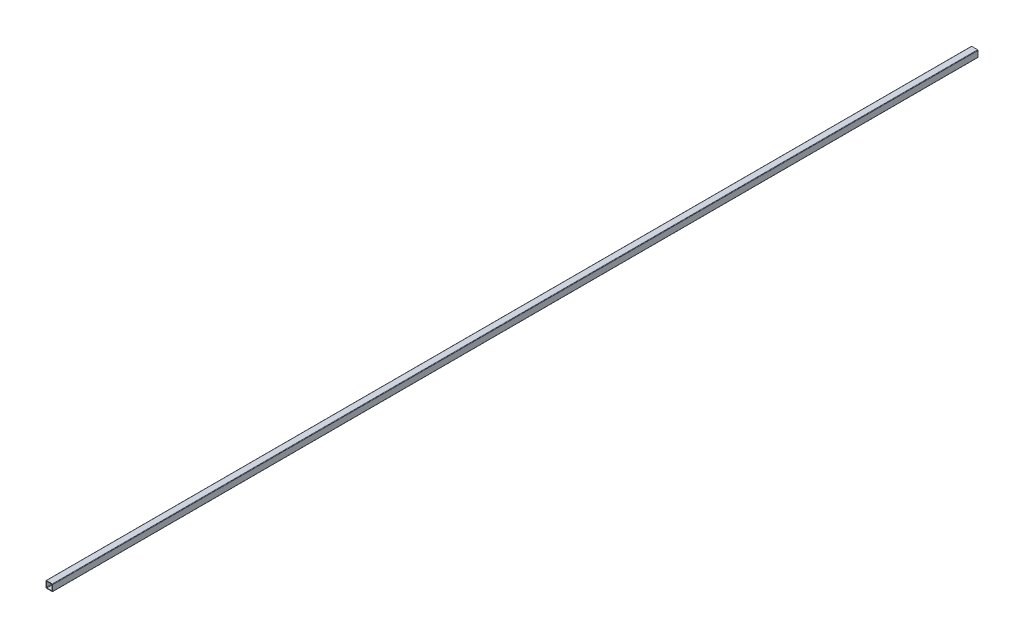
ISO-10303-21;
HEADER;
FILE_DESCRIPTION(('STEP AP214'),'2;1');
FILE_NAME('part.step','',(''),(''),'','','');
FILE_SCHEMA(('AUTOMOTIVE_DESIGN { 1 0 10303 214 1 1 1 1 }'));
ENDSEC;
DATA;
#1=APPLICATION_CONTEXT('core data for automotive mechanical design processes');
#2=APPLICATION_PROTOCOL_DEFINITION('international standard','automotive_design',2000,#1);
#3=PRODUCT_CONTEXT('',#1,'mechanical');
#4=PRODUCT('Part','Part','',(#3));
#5=PRODUCT_RELATED_PRODUCT_CATEGORY('part','',(#4));
#6=PRODUCT_DEFINITION_FORMATION('','',#4);
#7=PRODUCT_DEFINITION_CONTEXT('part definition',#1,'design');
#8=PRODUCT_DEFINITION('design','',#6,#7);
#9=PRODUCT_DEFINITION_SHAPE('','',#8);
#10=(LENGTH_UNIT() NAMED_UNIT(*) SI_UNIT(.MILLI.,.METRE.));
#11=(NAMED_UNIT(*) PLANE_ANGLE_UNIT() SI_UNIT($,.RADIAN.));
#12=(NAMED_UNIT(*) SI_UNIT($,.STERADIAN.) SOLID_ANGLE_UNIT());
#13=UNCERTAINTY_MEASURE_WITH_UNIT(LENGTH_MEASURE(1.E-05),#10,'distance_accuracy_value','');
#14=(GEOMETRIC_REPRESENTATION_CONTEXT(3) GLOBAL_UNCERTAINTY_ASSIGNED_CONTEXT((#13)) GLOBAL_UNIT_ASSIGNED_CONTEXT((#10,
#11,#12)) REPRESENTATION_CONTEXT('',''));
#15=CARTESIAN_POINT('',(0.,0.,0.));
#16=DIRECTION('',(0.,0.,1.));
#17=DIRECTION('',(1.,0.,0.));
#18=AXIS2_PLACEMENT_3D('',#15,#16,#17);
#19=CARTESIAN_POINT('',(2.54,-35.56,5243.80000006));
#20=DIRECTION('',(0.,0.,1.));
#21=DIRECTION('',(1.,0.,0.));
#22=AXIS2_PLACEMENT_3D('',#19,#20,#21);
#23=PLANE('',#22);
#24=CARTESIAN_POINT('',(2.54,-35.56,5243.80000006));
#25=DIRECTION('',(0.,0.,1.));
#26=DIRECTION('',(1.,0.,0.));
#27=AXIS2_PLACEMENT_3D('',#24,#25,#26);
#28=CIRCLE('',#27,2.54);
#29=CARTESIAN_POINT('',(0.,-35.56,5243.80000006));
#30=VERTEX_POINT('',#29);
#31=CARTESIAN_POINT('',(2.54000000000002,-38.1,5243.80000006));
#32=VERTEX_POINT('',#31);
#33=EDGE_CURVE('E210',#30,#32,#28,.T.);
#34=ORIENTED_EDGE('',*,*,#33,.T.);
#35=DIRECTION('',(1.,0.,0.));
#36=VECTOR('',#35,1.);
#37=CARTESIAN_POINT('',(2.54000000000002,-38.1,5243.80000006));
#38=LINE('',#37,#36);
#39=CARTESIAN_POINT('',(35.56,-38.1,5243.80000006));
#40=VERTEX_POINT('',#39);
#41=EDGE_CURVE('E213',#32,#40,#38,.T.);
#42=ORIENTED_EDGE('',*,*,#41,.T.);
#43=CARTESIAN_POINT('',(35.56,-35.56,5243.80000006));
#44=DIRECTION('',(0.,0.,1.));
#45=DIRECTION('',(-1.,0.,0.));
#46=AXIS2_PLACEMENT_3D('',#43,#44,#45);
#47=CIRCLE('',#46,2.54);
#48=CARTESIAN_POINT('',(38.1,-35.56,5243.80000006));
#49=VERTEX_POINT('',#48);
#50=EDGE_CURVE('E216',#40,#49,#47,.T.);
#51=ORIENTED_EDGE('',*,*,#50,.T.);
#52=DIRECTION('',(0.,1.,0.));
#53=VECTOR('',#52,1.);
#54=CARTESIAN_POINT('',(38.1,-2.54000000000002,5243.80000006));
#55=LINE('',#54,#53);
#56=CARTESIAN_POINT('',(38.1,-2.54000000000002,5243.80000006));
#57=VERTEX_POINT('',#56);
#58=EDGE_CURVE('E218',#49,#57,#55,.T.);
#59=ORIENTED_EDGE('',*,*,#58,.T.);
#60=CARTESIAN_POINT('',(35.56,-2.54,5243.80000006));
#61=DIRECTION('',(0.,0.,1.));
#62=DIRECTION('',(1.,0.,0.));
#63=AXIS2_PLACEMENT_3D('',#60,#61,#62);
#64=CIRCLE('',#63,2.54);
#65=CARTESIAN_POINT('',(35.56,0.,5243.80000006));
#66=VERTEX_POINT('',#65);
#67=EDGE_CURVE('E220',#57,#66,#64,.T.);
#68=ORIENTED_EDGE('',*,*,#67,.T.);
#69=DIRECTION('',(-1.,0.,0.));
#70=VECTOR('',#69,1.);
#71=CARTESIAN_POINT('',(2.54000000000002,0.,5243.80000006));
#72=LINE('',#71,#70);
#73=CARTESIAN_POINT('',(2.54000000000002,0.,5243.80000006));
#74=VERTEX_POINT('',#73);
#75=EDGE_CURVE('E222',#66,#74,#72,.T.);
#76=ORIENTED_EDGE('',*,*,#75,.T.);
#77=CARTESIAN_POINT('',(2.54,-2.54,5243.80000006));
#78=DIRECTION('',(0.,0.,1.));
#79=DIRECTION('',(-1.,0.,0.));
#80=AXIS2_PLACEMENT_3D('',#77,#78,#79);
#81=CIRCLE('',#80,2.54);
#82=CARTESIAN_POINT('',(0.,-2.54000000000002,5243.80000006));
#83=VERTEX_POINT('',#82);
#84=EDGE_CURVE('E224',#74,#83,#81,.T.);
#85=ORIENTED_EDGE('',*,*,#84,.T.);
#86=DIRECTION('',(0.,-1.,0.));
#87=VECTOR('',#86,1.);
#88=CARTESIAN_POINT('',(0.,-2.54000000000002,5243.80000006));
#89=LINE('',#88,#87);
#90=EDGE_CURVE('E226',#83,#30,#89,.T.);
#91=ORIENTED_EDGE('',*,*,#90,.T.);
#92=EDGE_LOOP('',(#34,#42,#51,#59,#68,#76,#85,#91));
#93=FACE_BOUND('',#92,.T.);
#94=DIRECTION('',(1.,0.,0.));
#95=VECTOR('',#94,1.);
#96=CARTESIAN_POINT('',(5.30860000000002,-35.3314,5243.80000006));
#97=LINE('',#96,#95);
#98=CARTESIAN_POINT('',(5.30860000000002,-35.3314,5243.80000006));
#99=VERTEX_POINT('',#98);
#100=CARTESIAN_POINT('',(32.7914,-35.3314,5243.80000006));
#101=VERTEX_POINT('',#100);
#102=EDGE_CURVE('E153',#99,#101,#97,.T.);
#103=ORIENTED_EDGE('',*,*,#102,.F.);
#104=CARTESIAN_POINT('',(5.3086,-32.7914,5243.80000006));
#105=DIRECTION('',(0.,0.,1.));
#106=DIRECTION('',(1.,0.,0.));
#107=AXIS2_PLACEMENT_3D('',#104,#105,#106);
#108=CIRCLE('',#107,2.54);
#109=CARTESIAN_POINT('',(2.7686,-32.7914,5243.80000006));
#110=VERTEX_POINT('',#109);
#111=EDGE_CURVE('E145',#110,#99,#108,.T.);
#112=ORIENTED_EDGE('',*,*,#111,.F.);
#113=DIRECTION('',(0.,-1.,0.));
#114=VECTOR('',#113,1.);
#115=CARTESIAN_POINT('',(2.7686,-5.30860000000002,5243.80000006));
#116=LINE('',#115,#114);
#117=CARTESIAN_POINT('',(2.7686,-5.30860000000002,5243.80000006));
#118=VERTEX_POINT('',#117);
#119=EDGE_CURVE('E178',#118,#110,#116,.T.);
#120=ORIENTED_EDGE('',*,*,#119,.F.);
#121=CARTESIAN_POINT('',(5.3086,-5.3086,5243.80000006));
#122=DIRECTION('',(0.,0.,1.));
#123=DIRECTION('',(1.,0.,0.));
#124=AXIS2_PLACEMENT_3D('',#121,#122,#123);
#125=CIRCLE('',#124,2.54);
#126=CARTESIAN_POINT('',(5.30860000000002,-2.7686,5243.80000006));
#127=VERTEX_POINT('',#126);
#128=EDGE_CURVE('E176',#127,#118,#125,.T.);
#129=ORIENTED_EDGE('',*,*,#128,.F.);
#130=DIRECTION('',(-1.,0.,0.));
#131=VECTOR('',#130,1.);
#132=CARTESIAN_POINT('',(5.30860000000002,-2.7686,5243.80000006));
#133=LINE('',#132,#131);
#134=CARTESIAN_POINT('',(32.7914,-2.7686,5243.80000006));
#135=VERTEX_POINT('',#134);
#136=EDGE_CURVE('E174',#135,#127,#133,.T.);
#137=ORIENTED_EDGE('',*,*,#136,.F.);
#138=CARTESIAN_POINT('',(32.7914,-5.3086,5243.80000006));
#139=DIRECTION('',(0.,0.,1.));
#140=DIRECTION('',(1.,0.,0.));
#141=AXIS2_PLACEMENT_3D('',#138,#139,#140);
#142=CIRCLE('',#141,2.54);
#143=CARTESIAN_POINT('',(35.3314,-5.30860000000002,5243.80000006));
#144=VERTEX_POINT('',#143);
#145=EDGE_CURVE('E172',#144,#135,#142,.T.);
#146=ORIENTED_EDGE('',*,*,#145,.F.);
#147=DIRECTION('',(0.,1.,0.));
#148=VECTOR('',#147,1.);
#149=CARTESIAN_POINT('',(35.3314,-5.30860000000002,5243.80000006));
#150=LINE('',#149,#148);
#151=CARTESIAN_POINT('',(35.3314,-32.7914,5243.80000006));
#152=VERTEX_POINT('',#151);
#153=EDGE_CURVE('E168',#152,#144,#150,.T.);
#154=ORIENTED_EDGE('',*,*,#153,.F.);
#155=CARTESIAN_POINT('',(32.7914,-32.7914,5243.80000006));
#156=DIRECTION('',(0.,0.,1.));
#157=DIRECTION('',(1.,0.,0.));
#158=AXIS2_PLACEMENT_3D('',#155,#156,#157);
#159=CIRCLE('',#158,2.54);
#160=EDGE_CURVE('E166',#101,#152,#159,.T.);
#161=ORIENTED_EDGE('',*,*,#160,.F.);
#162=EDGE_LOOP('',(#103,#112,#120,#129,#137,#146,#154,#161));
#163=FACE_BOUND('',#162,.T.);
#164=ADVANCED_FACE('F32',(#93,#163),#23,.T.);
#165=CARTESIAN_POINT('',(2.54,-35.56,0.));
#166=DIRECTION('',(0.,0.,1.));
#167=DIRECTION('',(1.,0.,0.));
#168=AXIS2_PLACEMENT_3D('',#165,#166,#167);
#169=PLANE('',#168);
#170=CARTESIAN_POINT('',(2.54,-35.56,0.));
#171=DIRECTION('',(0.,0.,1.));
#172=DIRECTION('',(1.,0.,0.));
#173=AXIS2_PLACEMENT_3D('',#170,#171,#172);
#174=CIRCLE('',#173,2.54);
#175=CARTESIAN_POINT('',(0.,-35.56,0.));
#176=VERTEX_POINT('',#175);
#177=CARTESIAN_POINT('',(2.54000000000002,-38.1,0.));
#178=VERTEX_POINT('',#177);
#179=EDGE_CURVE('E161',#176,#178,#174,.T.);
#180=ORIENTED_EDGE('',*,*,#179,.F.);
#181=DIRECTION('',(0.,-1.,0.));
#182=VECTOR('',#181,1.);
#183=CARTESIAN_POINT('',(0.,-2.54000000000002,0.));
#184=LINE('',#183,#182);
#185=CARTESIAN_POINT('',(0.,-2.54000000000002,0.));
#186=VERTEX_POINT('',#185);
#187=EDGE_CURVE('E214',#186,#176,#184,.T.);
#188=ORIENTED_EDGE('',*,*,#187,.F.);
#189=CARTESIAN_POINT('',(2.54,-2.54,0.));
#190=DIRECTION('',(0.,0.,1.));
#191=DIRECTION('',(-1.,0.,0.));
#192=AXIS2_PLACEMENT_3D('',#189,#190,#191);
#193=CIRCLE('',#192,2.54);
#194=CARTESIAN_POINT('',(2.54000000000002,0.,0.));
#195=VERTEX_POINT('',#194);
#196=EDGE_CURVE('E241',#195,#186,#193,.T.);
#197=ORIENTED_EDGE('',*,*,#196,.F.);
#198=DIRECTION('',(-1.,0.,0.));
#199=VECTOR('',#198,1.);
#200=CARTESIAN_POINT('',(2.54000000000002,0.,0.));
#201=LINE('',#200,#199);
#202=CARTESIAN_POINT('',(35.56,0.,0.));
#203=VERTEX_POINT('',#202);
#204=EDGE_CURVE('E239',#203,#195,#201,.T.);
#205=ORIENTED_EDGE('',*,*,#204,.F.);
#206=CARTESIAN_POINT('',(35.56,-2.54,0.));
#207=DIRECTION('',(0.,0.,1.));
#208=DIRECTION('',(1.,0.,0.));
#209=AXIS2_PLACEMENT_3D('',#206,#207,#208);
#210=CIRCLE('',#209,2.54);
#211=CARTESIAN_POINT('',(38.1,-2.54000000000002,0.));
#212=VERTEX_POINT('',#211);
#213=EDGE_CURVE('E237',#212,#203,#210,.T.);
#214=ORIENTED_EDGE('',*,*,#213,.F.);
#215=DIRECTION('',(0.,1.,0.));
#216=VECTOR('',#215,1.);
#217=CARTESIAN_POINT('',(38.1,-2.54000000000002,0.));
#218=LINE('',#217,#216);
#219=CARTESIAN_POINT('',(38.1,-35.56,0.));
#220=VERTEX_POINT('',#219);
#221=EDGE_CURVE('E235',#220,#212,#218,.T.);
#222=ORIENTED_EDGE('',*,*,#221,.F.);
#223=CARTESIAN_POINT('',(35.56,-35.56,0.));
#224=DIRECTION('',(0.,0.,1.));
#225=DIRECTION('',(-1.,0.,0.));
#226=AXIS2_PLACEMENT_3D('',#223,#224,#225);
#227=CIRCLE('',#226,2.54);
#228=CARTESIAN_POINT('',(35.56,-38.1,0.));
#229=VERTEX_POINT('',#228);
#230=EDGE_CURVE('E233',#229,#220,#227,.T.);
#231=ORIENTED_EDGE('',*,*,#230,.F.);
#232=DIRECTION('',(1.,0.,0.));
#233=VECTOR('',#232,1.);
#234=CARTESIAN_POINT('',(2.54000000000002,-38.1,0.));
#235=LINE('',#234,#233);
#236=EDGE_CURVE('E231',#178,#229,#235,.T.);
#237=ORIENTED_EDGE('',*,*,#236,.F.);
#238=EDGE_LOOP('',(#180,#188,#197,#205,#214,#222,#231,#237));
#239=FACE_BOUND('',#238,.T.);
#240=CARTESIAN_POINT('',(5.3086,-32.7914,0.));
#241=DIRECTION('',(0.,0.,1.));
#242=DIRECTION('',(1.,0.,0.));
#243=AXIS2_PLACEMENT_3D('',#240,#241,#242);
#244=CIRCLE('',#243,2.54);
#245=CARTESIAN_POINT('',(2.7686,-32.7914,0.));
#246=VERTEX_POINT('',#245);
#247=CARTESIAN_POINT('',(5.30860000000002,-35.3314,0.));
#248=VERTEX_POINT('',#247);
#249=EDGE_CURVE('E55',#246,#248,#244,.T.);
#250=ORIENTED_EDGE('',*,*,#249,.T.);
#251=DIRECTION('',(1.,0.,0.));
#252=VECTOR('',#251,1.);
#253=CARTESIAN_POINT('',(5.30860000000002,-35.3314,0.));
#254=LINE('',#253,#252);
#255=CARTESIAN_POINT('',(32.7914,-35.3314,0.));
#256=VERTEX_POINT('',#255);
#257=EDGE_CURVE('E160',#248,#256,#254,.T.);
#258=ORIENTED_EDGE('',*,*,#257,.T.);
#259=CARTESIAN_POINT('',(32.7914,-32.7914,0.));
#260=DIRECTION('',(0.,0.,1.));
#261=DIRECTION('',(1.,0.,0.));
#262=AXIS2_PLACEMENT_3D('',#259,#260,#261);
#263=CIRCLE('',#262,2.54);
#264=CARTESIAN_POINT('',(35.3314,-32.7914,0.));
#265=VERTEX_POINT('',#264);
#266=EDGE_CURVE('E182',#256,#265,#263,.T.);
#267=ORIENTED_EDGE('',*,*,#266,.T.);
#268=DIRECTION('',(0.,1.,0.));
#269=VECTOR('',#268,1.);
#270=CARTESIAN_POINT('',(35.3314,-5.30860000000002,0.));
#271=LINE('',#270,#269);
#272=CARTESIAN_POINT('',(35.3314,-5.30860000000002,0.));
#273=VERTEX_POINT('',#272);
#274=EDGE_CURVE('E185',#265,#273,#271,.T.);
#275=ORIENTED_EDGE('',*,*,#274,.T.);
#276=CARTESIAN_POINT('',(32.7914,-5.3086,0.));
#277=DIRECTION('',(0.,0.,1.));
#278=DIRECTION('',(1.,0.,0.));
#279=AXIS2_PLACEMENT_3D('',#276,#277,#278);
#280=CIRCLE('',#279,2.54);
#281=CARTESIAN_POINT('',(32.7914,-2.7686,0.));
#282=VERTEX_POINT('',#281);
#283=EDGE_CURVE('E188',#273,#282,#280,.T.);
#284=ORIENTED_EDGE('',*,*,#283,.T.);
#285=DIRECTION('',(-1.,0.,0.));
#286=VECTOR('',#285,1.);
#287=CARTESIAN_POINT('',(5.30860000000002,-2.7686,0.));
#288=LINE('',#287,#286);
#289=CARTESIAN_POINT('',(5.30860000000002,-2.7686,0.));
#290=VERTEX_POINT('',#289);
#291=EDGE_CURVE('E191',#282,#290,#288,.T.);
#292=ORIENTED_EDGE('',*,*,#291,.T.);
#293=CARTESIAN_POINT('',(5.3086,-5.3086,0.));
#294=DIRECTION('',(0.,0.,1.));
#295=DIRECTION('',(1.,0.,0.));
#296=AXIS2_PLACEMENT_3D('',#293,#294,#295);
#297=CIRCLE('',#296,2.54);
#298=CARTESIAN_POINT('',(2.7686,-5.30860000000002,0.));
#299=VERTEX_POINT('',#298);
#300=EDGE_CURVE('E194',#290,#299,#297,.T.);
#301=ORIENTED_EDGE('',*,*,#300,.T.);
#302=DIRECTION('',(0.,-1.,0.));
#303=VECTOR('',#302,1.);
#304=CARTESIAN_POINT('',(2.7686,-5.30860000000002,0.));
#305=LINE('',#304,#303);
#306=EDGE_CURVE('E154',#299,#246,#305,.T.);
#307=ORIENTED_EDGE('',*,*,#306,.T.);
#308=EDGE_LOOP('',(#250,#258,#267,#275,#284,#292,#301,#307));
#309=FACE_BOUND('',#308,.T.);
#310=ADVANCED_FACE('F271',(#239,#309),#169,.F.);
#311=CARTESIAN_POINT('',(2.54,-35.56,5243.80000006));
#312=DIRECTION('',(0.,0.,-1.));
#313=DIRECTION('',(-1.,0.,0.));
#314=AXIS2_PLACEMENT_3D('',#311,#312,#313);
#315=CYLINDRICAL_SURFACE('',#314,2.54);
#316=ORIENTED_EDGE('',*,*,#179,.T.);
#317=DIRECTION('',(0.,0.,-1.));
#318=VECTOR('',#317,1.);
#319=CARTESIAN_POINT('',(2.54000000000002,-38.1,5243.80000006));
#320=LINE('',#319,#318);
#321=EDGE_CURVE('E11',#32,#178,#320,.T.);
#322=ORIENTED_EDGE('',*,*,#321,.F.);
#323=ORIENTED_EDGE('',*,*,#33,.F.);
#324=DIRECTION('',(0.,0.,-1.));
#325=VECTOR('',#324,1.);
#326=CARTESIAN_POINT('',(0.,-35.56,5243.80000006));
#327=LINE('',#326,#325);
#328=EDGE_CURVE('E228',#30,#176,#327,.T.);
#329=ORIENTED_EDGE('',*,*,#328,.T.);
#330=EDGE_LOOP('',(#316,#322,#323,#329));
#331=FACE_BOUND('',#330,.T.);
#332=ADVANCED_FACE('F34',(#331),#315,.T.);
#333=CARTESIAN_POINT('',(2.54000000000002,-38.1,5243.80000006));
#334=DIRECTION('',(0.,1.,0.));
#335=DIRECTION('',(0.,0.,1.));
#336=AXIS2_PLACEMENT_3D('',#333,#334,#335);
#337=PLANE('',#336);
#338=ORIENTED_EDGE('',*,*,#236,.T.);
#339=DIRECTION('',(0.,0.,-1.));
#340=VECTOR('',#339,1.);
#341=CARTESIAN_POINT('',(35.56,-38.1,5243.80000006));
#342=LINE('',#341,#340);
#343=EDGE_CURVE('E40',#40,#229,#342,.T.);
#344=ORIENTED_EDGE('',*,*,#343,.F.);
#345=ORIENTED_EDGE('',*,*,#41,.F.);
#346=ORIENTED_EDGE('',*,*,#321,.T.);
#347=EDGE_LOOP('',(#338,#344,#345,#346));
#348=FACE_BOUND('',#347,.T.);
#349=ADVANCED_FACE('F288',(#348),#337,.F.);
#350=CARTESIAN_POINT('',(35.56,-35.56,5243.80000006));
#351=DIRECTION('',(0.,0.,-1.));
#352=DIRECTION('',(-1.,0.,0.));
#353=AXIS2_PLACEMENT_3D('',#350,#351,#352);
#354=CYLINDRICAL_SURFACE('',#353,2.54);
#355=ORIENTED_EDGE('',*,*,#230,.T.);
#356=DIRECTION('',(0.,0.,-1.));
#357=VECTOR('',#356,1.);
#358=CARTESIAN_POINT('',(38.1,-35.56,5243.80000006));
#359=LINE('',#358,#357);
#360=EDGE_CURVE('E258',#49,#220,#359,.T.);
#361=ORIENTED_EDGE('',*,*,#360,.F.);
#362=ORIENTED_EDGE('',*,*,#50,.F.);
#363=ORIENTED_EDGE('',*,*,#343,.T.);
#364=EDGE_LOOP('',(#355,#361,#362,#363));
#365=FACE_BOUND('',#364,.T.);
#366=ADVANCED_FACE('F265',(#365),#354,.T.);
#367=CARTESIAN_POINT('',(38.1,-2.54000000000002,5243.80000006));
#368=DIRECTION('',(-1.,0.,0.));
#369=DIRECTION('',(0.,-1.,0.));
#370=AXIS2_PLACEMENT_3D('',#367,#368,#369);
#371=PLANE('',#370);
#372=ORIENTED_EDGE('',*,*,#221,.T.);
#373=DIRECTION('',(0.,0.,-1.));
#374=VECTOR('',#373,1.);
#375=CARTESIAN_POINT('',(38.1,-2.54000000000002,5243.80000006));
#376=LINE('',#375,#374);
#377=EDGE_CURVE('E255',#57,#212,#376,.T.);
#378=ORIENTED_EDGE('',*,*,#377,.F.);
#379=ORIENTED_EDGE('',*,*,#58,.F.);
#380=ORIENTED_EDGE('',*,*,#360,.T.);
#381=EDGE_LOOP('',(#372,#378,#379,#380));
#382=FACE_BOUND('',#381,.T.);
#383=ADVANCED_FACE('F277',(#382),#371,.F.);
#384=CARTESIAN_POINT('',(35.56,-2.54,5243.80000006));
#385=DIRECTION('',(0.,0.,-1.));
#386=DIRECTION('',(-1.,0.,0.));
#387=AXIS2_PLACEMENT_3D('',#384,#385,#386);
#388=CYLINDRICAL_SURFACE('',#387,2.54);
#389=ORIENTED_EDGE('',*,*,#213,.T.);
#390=DIRECTION('',(0.,0.,-1.));
#391=VECTOR('',#390,1.);
#392=CARTESIAN_POINT('',(35.56,0.,5243.80000006));
#393=LINE('',#392,#391);
#394=EDGE_CURVE('E252',#66,#203,#393,.T.);
#395=ORIENTED_EDGE('',*,*,#394,.F.);
#396=ORIENTED_EDGE('',*,*,#67,.F.);
#397=ORIENTED_EDGE('',*,*,#377,.T.);
#398=EDGE_LOOP('',(#389,#395,#396,#397));
#399=FACE_BOUND('',#398,.T.);
#400=ADVANCED_FACE('F281',(#399),#388,.T.);
#401=CARTESIAN_POINT('',(2.54000000000002,0.,5243.80000006));
#402=DIRECTION('',(0.,-1.,0.));
#403=DIRECTION('',(0.,0.,-1.));
#404=AXIS2_PLACEMENT_3D('',#401,#402,#403);
#405=PLANE('',#404);
#406=ORIENTED_EDGE('',*,*,#204,.T.);
#407=DIRECTION('',(0.,0.,-1.));
#408=VECTOR('',#407,1.);
#409=CARTESIAN_POINT('',(2.54000000000002,0.,5243.80000006));
#410=LINE('',#409,#408);
#411=EDGE_CURVE('E249',#74,#195,#410,.T.);
#412=ORIENTED_EDGE('',*,*,#411,.F.);
#413=ORIENTED_EDGE('',*,*,#75,.F.);
#414=ORIENTED_EDGE('',*,*,#394,.T.);
#415=EDGE_LOOP('',(#406,#412,#413,#414));
#416=FACE_BOUND('',#415,.T.);
#417=ADVANCED_FACE('F301',(#416),#405,.F.);
#418=CARTESIAN_POINT('',(2.54,-2.54,5243.80000006));
#419=DIRECTION('',(0.,0.,-1.));
#420=DIRECTION('',(-1.,0.,0.));
#421=AXIS2_PLACEMENT_3D('',#418,#419,#420);
#422=CYLINDRICAL_SURFACE('',#421,2.54);
#423=ORIENTED_EDGE('',*,*,#196,.T.);
#424=DIRECTION('',(0.,0.,-1.));
#425=VECTOR('',#424,1.);
#426=CARTESIAN_POINT('',(0.,-2.54000000000002,5243.80000006));
#427=LINE('',#426,#425);
#428=EDGE_CURVE('E246',#83,#186,#427,.T.);
#429=ORIENTED_EDGE('',*,*,#428,.F.);
#430=ORIENTED_EDGE('',*,*,#84,.F.);
#431=ORIENTED_EDGE('',*,*,#411,.T.);
#432=EDGE_LOOP('',(#423,#429,#430,#431));
#433=FACE_BOUND('',#432,.T.);
#434=ADVANCED_FACE('F299',(#433),#422,.T.);
#435=CARTESIAN_POINT('',(0.,-2.54000000000002,5243.80000006));
#436=DIRECTION('',(1.,0.,0.));
#437=DIRECTION('',(0.,1.,0.));
#438=AXIS2_PLACEMENT_3D('',#435,#436,#437);
#439=PLANE('',#438);
#440=ORIENTED_EDGE('',*,*,#187,.T.);
#441=ORIENTED_EDGE('',*,*,#328,.F.);
#442=ORIENTED_EDGE('',*,*,#90,.F.);
#443=ORIENTED_EDGE('',*,*,#428,.T.);
#444=EDGE_LOOP('',(#440,#441,#442,#443));
#445=FACE_BOUND('',#444,.T.);
#446=ADVANCED_FACE('F294',(#445),#439,.F.);
#447=CARTESIAN_POINT('',(5.3086,-32.7914,5243.80000006));
#448=DIRECTION('',(0.,0.,-1.));
#449=DIRECTION('',(-1.,0.,0.));
#450=AXIS2_PLACEMENT_3D('',#447,#448,#449);
#451=CYLINDRICAL_SURFACE('',#450,2.54);
#452=ORIENTED_EDGE('',*,*,#249,.F.);
#453=DIRECTION('',(0.,0.,-1.));
#454=VECTOR('',#453,1.);
#455=CARTESIAN_POINT('',(2.7686,-32.7914,5243.80000006));
#456=LINE('',#455,#454);
#457=EDGE_CURVE('E149',#110,#246,#456,.T.);
#458=ORIENTED_EDGE('',*,*,#457,.F.);
#459=ORIENTED_EDGE('',*,*,#111,.T.);
#460=DIRECTION('',(0.,0.,-1.));
#461=VECTOR('',#460,1.);
#462=CARTESIAN_POINT('',(5.30860000000002,-35.3314,5243.80000006));
#463=LINE('',#462,#461);
#464=EDGE_CURVE('E148',#99,#248,#463,.T.);
#465=ORIENTED_EDGE('',*,*,#464,.T.);
#466=EDGE_LOOP('',(#452,#458,#459,#465));
#467=FACE_BOUND('',#466,.T.);
#468=ADVANCED_FACE('F147',(#467),#451,.F.);
#469=CARTESIAN_POINT('',(5.30860000000002,-35.3314,5243.80000006));
#470=DIRECTION('',(0.,1.,0.));
#471=DIRECTION('',(0.,0.,1.));
#472=AXIS2_PLACEMENT_3D('',#469,#470,#471);
#473=PLANE('',#472);
#474=ORIENTED_EDGE('',*,*,#257,.F.);
#475=ORIENTED_EDGE('',*,*,#464,.F.);
#476=ORIENTED_EDGE('',*,*,#102,.T.);
#477=DIRECTION('',(0.,0.,-1.));
#478=VECTOR('',#477,1.);
#479=CARTESIAN_POINT('',(32.7914,-35.3314,5243.80000006));
#480=LINE('',#479,#478);
#481=EDGE_CURVE('E162',#101,#256,#480,.T.);
#482=ORIENTED_EDGE('',*,*,#481,.T.);
#483=EDGE_LOOP('',(#474,#475,#476,#482));
#484=FACE_BOUND('',#483,.T.);
#485=ADVANCED_FACE('F157',(#484),#473,.T.);
#486=CARTESIAN_POINT('',(32.7914,-32.7914,5243.80000006));
#487=DIRECTION('',(0.,0.,-1.));
#488=DIRECTION('',(-1.,0.,0.));
#489=AXIS2_PLACEMENT_3D('',#486,#487,#488);
#490=CYLINDRICAL_SURFACE('',#489,2.54);
#491=ORIENTED_EDGE('',*,*,#266,.F.);
#492=ORIENTED_EDGE('',*,*,#481,.F.);
#493=ORIENTED_EDGE('',*,*,#160,.T.);
#494=DIRECTION('',(0.,0.,-1.));
#495=VECTOR('',#494,1.);
#496=CARTESIAN_POINT('',(35.3314,-32.7914,5243.80000006));
#497=LINE('',#496,#495);
#498=EDGE_CURVE('E207',#152,#265,#497,.T.);
#499=ORIENTED_EDGE('',*,*,#498,.T.);
#500=EDGE_LOOP('',(#491,#492,#493,#499));
#501=FACE_BOUND('',#500,.T.);
#502=ADVANCED_FACE('F326',(#501),#490,.F.);
#503=CARTESIAN_POINT('',(35.3314,-5.30860000000002,5243.80000006));
#504=DIRECTION('',(-1.,0.,0.));
#505=DIRECTION('',(0.,0.,1.));
#506=AXIS2_PLACEMENT_3D('',#503,#504,#505);
#507=PLANE('',#506);
#508=ORIENTED_EDGE('',*,*,#274,.F.);
#509=ORIENTED_EDGE('',*,*,#498,.F.);
#510=ORIENTED_EDGE('',*,*,#153,.T.);
#511=DIRECTION('',(0.,0.,-1.));
#512=VECTOR('',#511,1.);
#513=CARTESIAN_POINT('',(35.3314,-5.30860000000002,5243.80000006));
#514=LINE('',#513,#512);
#515=EDGE_CURVE('E205',#144,#273,#514,.T.);
#516=ORIENTED_EDGE('',*,*,#515,.T.);
#517=EDGE_LOOP('',(#508,#509,#510,#516));
#518=FACE_BOUND('',#517,.T.);
#519=ADVANCED_FACE('F330',(#518),#507,.T.);
#520=CARTESIAN_POINT('',(32.7914,-5.3086,5243.80000006));
#521=DIRECTION('',(0.,0.,-1.));
#522=DIRECTION('',(-1.,0.,0.));
#523=AXIS2_PLACEMENT_3D('',#520,#521,#522);
#524=CYLINDRICAL_SURFACE('',#523,2.54);
#525=ORIENTED_EDGE('',*,*,#283,.F.);
#526=ORIENTED_EDGE('',*,*,#515,.F.);
#527=ORIENTED_EDGE('',*,*,#145,.T.);
#528=DIRECTION('',(0.,0.,-1.));
#529=VECTOR('',#528,1.);
#530=CARTESIAN_POINT('',(32.7914,-2.7686,5243.80000006));
#531=LINE('',#530,#529);
#532=EDGE_CURVE('E203',#135,#282,#531,.T.);
#533=ORIENTED_EDGE('',*,*,#532,.T.);
#534=EDGE_LOOP('',(#525,#526,#527,#533));
#535=FACE_BOUND('',#534,.T.);
#536=ADVANCED_FACE('F336',(#535),#524,.F.);
#537=CARTESIAN_POINT('',(5.30860000000002,-2.7686,5243.80000006));
#538=DIRECTION('',(0.,-1.,0.));
#539=DIRECTION('',(0.,0.,-1.));
#540=AXIS2_PLACEMENT_3D('',#537,#538,#539);
#541=PLANE('',#540);
#542=ORIENTED_EDGE('',*,*,#291,.F.);
#543=ORIENTED_EDGE('',*,*,#532,.F.);
#544=ORIENTED_EDGE('',*,*,#136,.T.);
#545=DIRECTION('',(0.,0.,-1.));
#546=VECTOR('',#545,1.);
#547=CARTESIAN_POINT('',(5.30860000000002,-2.7686,5243.80000006));
#548=LINE('',#547,#546);
#549=EDGE_CURVE('E201',#127,#290,#548,.T.);
#550=ORIENTED_EDGE('',*,*,#549,.T.);
#551=EDGE_LOOP('',(#542,#543,#544,#550));
#552=FACE_BOUND('',#551,.T.);
#553=ADVANCED_FACE('F340',(#552),#541,.T.);
#554=CARTESIAN_POINT('',(5.3086,-5.3086,5243.80000006));
#555=DIRECTION('',(0.,0.,-1.));
#556=DIRECTION('',(-1.,0.,0.));
#557=AXIS2_PLACEMENT_3D('',#554,#555,#556);
#558=CYLINDRICAL_SURFACE('',#557,2.54);
#559=ORIENTED_EDGE('',*,*,#300,.F.);
#560=ORIENTED_EDGE('',*,*,#549,.F.);
#561=ORIENTED_EDGE('',*,*,#128,.T.);
#562=DIRECTION('',(0.,0.,-1.));
#563=VECTOR('',#562,1.);
#564=CARTESIAN_POINT('',(2.7686,-5.30860000000002,5243.80000006));
#565=LINE('',#564,#563);
#566=EDGE_CURVE('E47',#118,#299,#565,.T.);
#567=ORIENTED_EDGE('',*,*,#566,.T.);
#568=EDGE_LOOP('',(#559,#560,#561,#567));
#569=FACE_BOUND('',#568,.T.);
#570=ADVANCED_FACE('F344',(#569),#558,.F.);
#571=CARTESIAN_POINT('',(2.7686,-5.30860000000002,5243.80000006));
#572=DIRECTION('',(1.,0.,0.));
#573=DIRECTION('',(0.,0.,-1.));
#574=AXIS2_PLACEMENT_3D('',#571,#572,#573);
#575=PLANE('',#574);
#576=ORIENTED_EDGE('',*,*,#306,.F.);
#577=ORIENTED_EDGE('',*,*,#566,.F.);
#578=ORIENTED_EDGE('',*,*,#119,.T.);
#579=ORIENTED_EDGE('',*,*,#457,.T.);
#580=EDGE_LOOP('',(#576,#577,#578,#579));
#581=FACE_BOUND('',#580,.T.);
#582=ADVANCED_FACE('F348',(#581),#575,.T.);
#583=CLOSED_SHELL('',(#164,#310,#332,#349,#366,#383,#400,#417,#434,#446,#468,#485,#502,#519,
#536,#553,#570,#582));
#584=MANIFOLD_SOLID_BREP('B2',#583);
#585=ADVANCED_BREP_SHAPE_REPRESENTATION('',(#18,#584),#14);
#586=SHAPE_DEFINITION_REPRESENTATION(#9,#585);
ENDSEC;
END-ISO-10303-21;
